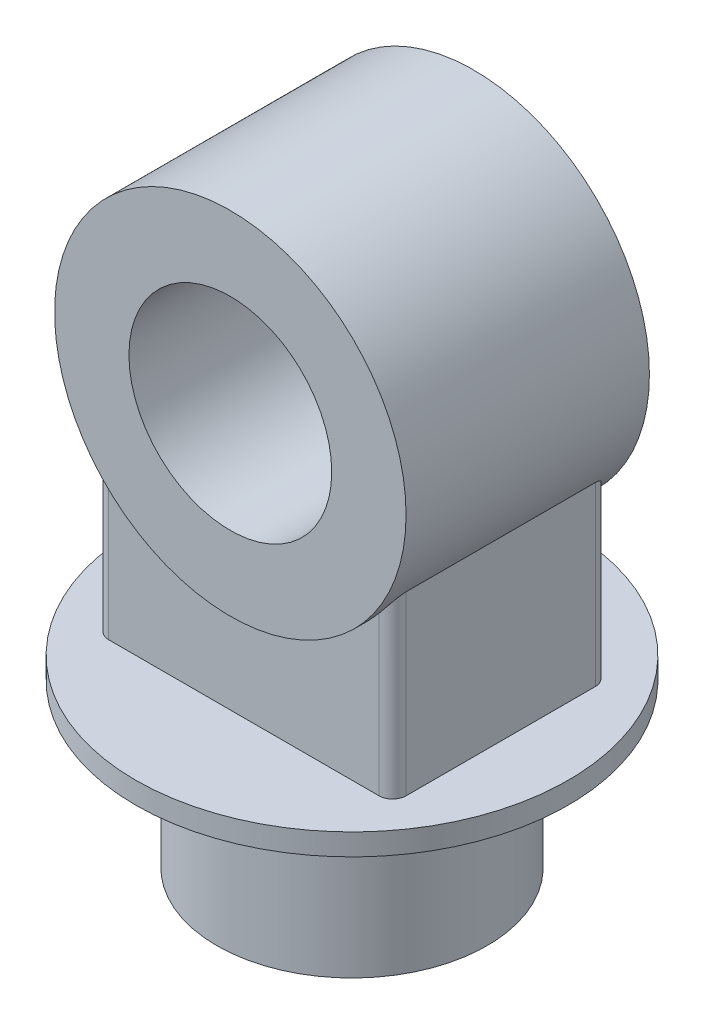
ISO-10303-21;
HEADER;
FILE_DESCRIPTION(('STEP AP214'),'2;1');
FILE_NAME('part.step','',(''),(''),'','','');
FILE_SCHEMA(('AUTOMOTIVE_DESIGN { 1 0 10303 214 1 1 1 1 }'));
ENDSEC;
DATA;
#1=APPLICATION_CONTEXT('core data for automotive mechanical design processes');
#2=APPLICATION_PROTOCOL_DEFINITION('international standard','automotive_design',2000,#1);
#3=PRODUCT_CONTEXT('',#1,'mechanical');
#4=PRODUCT('Part','Part','',(#3));
#5=PRODUCT_RELATED_PRODUCT_CATEGORY('part','',(#4));
#6=PRODUCT_DEFINITION_FORMATION('','',#4);
#7=PRODUCT_DEFINITION_CONTEXT('part definition',#1,'design');
#8=PRODUCT_DEFINITION('design','',#6,#7);
#9=PRODUCT_DEFINITION_SHAPE('','',#8);
#10=(LENGTH_UNIT() NAMED_UNIT(*) SI_UNIT(.MILLI.,.METRE.));
#11=(NAMED_UNIT(*) PLANE_ANGLE_UNIT() SI_UNIT($,.RADIAN.));
#12=(NAMED_UNIT(*) SI_UNIT($,.STERADIAN.) SOLID_ANGLE_UNIT());
#13=UNCERTAINTY_MEASURE_WITH_UNIT(LENGTH_MEASURE(1.E-05),#10,'distance_accuracy_value','');
#14=(GEOMETRIC_REPRESENTATION_CONTEXT(3) GLOBAL_UNCERTAINTY_ASSIGNED_CONTEXT((#13)) GLOBAL_UNIT_ASSIGNED_CONTEXT((#10,
#11,#12)) REPRESENTATION_CONTEXT('',''));
#15=CARTESIAN_POINT('',(0.,0.,0.));
#16=DIRECTION('',(0.,0.,1.));
#17=DIRECTION('',(1.,0.,0.));
#18=AXIS2_PLACEMENT_3D('',#15,#16,#17);
#19=CARTESIAN_POINT('',(0.,136.,0.));
#20=DIRECTION('',(0.,1.,0.));
#21=DIRECTION('',(0.,0.,1.));
#22=AXIS2_PLACEMENT_3D('',#19,#20,#21);
#23=PLANE('',#22);
#24=CARTESIAN_POINT('',(0.,136.,0.));
#25=DIRECTION('',(0.,1.,0.));
#26=DIRECTION('',(0.,0.,1.));
#27=AXIS2_PLACEMENT_3D('',#24,#25,#26);
#28=CIRCLE('',#27,160.);
#29=CARTESIAN_POINT('',(0.,136.,160.));
#30=VERTEX_POINT('',#29);
#31=EDGE_CURVE('E235',#30,#30,#28,.T.);
#32=ORIENTED_EDGE('',*,*,#31,.T.);
#33=EDGE_LOOP('',(#32));
#34=FACE_BOUND('',#33,.T.);
#35=DIRECTION('',(0.,0.,1.));
#36=VECTOR('',#35,1.);
#37=CARTESIAN_POINT('',(-110.,136.,-80.));
#38=LINE('',#37,#36);
#39=CARTESIAN_POINT('',(-110.,136.,-70.));
#40=VERTEX_POINT('',#39);
#41=CARTESIAN_POINT('',(-110.,136.,70.));
#42=VERTEX_POINT('',#41);
#43=EDGE_CURVE('E251',#40,#42,#38,.T.);
#44=ORIENTED_EDGE('',*,*,#43,.F.);
#45=CARTESIAN_POINT('',(-100.,136.000000000024,-70.));
#46=DIRECTION('',(0.,1.,0.));
#47=DIRECTION('',(0.,0.,1.));
#48=AXIS2_PLACEMENT_3D('',#45,#46,#47);
#49=CIRCLE('',#48,10.);
#50=CARTESIAN_POINT('',(-100.,136.,-80.));
#51=VERTEX_POINT('',#50);
#52=EDGE_CURVE('E61',#40,#51,#49,.F.);
#53=ORIENTED_EDGE('',*,*,#52,.T.);
#54=DIRECTION('',(-1.,0.,0.));
#55=VECTOR('',#54,1.);
#56=CARTESIAN_POINT('',(-110.,136.,-80.));
#57=LINE('',#56,#55);
#58=CARTESIAN_POINT('',(100.,136.,-80.));
#59=VERTEX_POINT('',#58);
#60=EDGE_CURVE('E139',#59,#51,#57,.T.);
#61=ORIENTED_EDGE('',*,*,#60,.F.);
#62=CARTESIAN_POINT('',(100.,136.000000000024,-70.));
#63=DIRECTION('',(0.,1.,0.));
#64=DIRECTION('',(0.,0.,1.));
#65=AXIS2_PLACEMENT_3D('',#62,#63,#64);
#66=CIRCLE('',#65,10.);
#67=CARTESIAN_POINT('',(110.,136.,-70.));
#68=VERTEX_POINT('',#67);
#69=EDGE_CURVE('E75',#59,#68,#66,.F.);
#70=ORIENTED_EDGE('',*,*,#69,.T.);
#71=DIRECTION('',(0.,0.,-1.));
#72=VECTOR('',#71,1.);
#73=CARTESIAN_POINT('',(110.,136.,-80.));
#74=LINE('',#73,#72);
#75=CARTESIAN_POINT('',(110.,136.,70.));
#76=VERTEX_POINT('',#75);
#77=EDGE_CURVE('E242',#76,#68,#74,.T.);
#78=ORIENTED_EDGE('',*,*,#77,.F.);
#79=CARTESIAN_POINT('',(100.,136.000000000024,70.));
#80=DIRECTION('',(0.,1.,0.));
#81=DIRECTION('',(0.,0.,1.));
#82=AXIS2_PLACEMENT_3D('',#79,#80,#81);
#83=CIRCLE('',#82,10.);
#84=CARTESIAN_POINT('',(100.,136.,80.));
#85=VERTEX_POINT('',#84);
#86=EDGE_CURVE('E130',#76,#85,#83,.F.);
#87=ORIENTED_EDGE('',*,*,#86,.T.);
#88=DIRECTION('',(1.,0.,0.));
#89=VECTOR('',#88,1.);
#90=CARTESIAN_POINT('',(-110.,136.,80.));
#91=LINE('',#90,#89);
#92=CARTESIAN_POINT('',(-100.,136.,80.));
#93=VERTEX_POINT('',#92);
#94=EDGE_CURVE('E248',#93,#85,#91,.T.);
#95=ORIENTED_EDGE('',*,*,#94,.F.);
#96=CARTESIAN_POINT('',(-100.,136.000000000024,70.));
#97=DIRECTION('',(0.,1.,0.));
#98=DIRECTION('',(0.,0.,1.));
#99=AXIS2_PLACEMENT_3D('',#96,#97,#98);
#100=CIRCLE('',#99,10.);
#101=EDGE_CURVE('E129',#93,#42,#100,.F.);
#102=ORIENTED_EDGE('',*,*,#101,.T.);
#103=EDGE_LOOP('',(#44,#53,#61,#70,#78,#87,#95,#102));
#104=FACE_BOUND('',#103,.T.);
#105=ADVANCED_FACE('F48',(#34,#104),#23,.T.);
#106=CARTESIAN_POINT('',(0.,120.,0.));
#107=DIRECTION('',(0.,-1.,0.));
#108=DIRECTION('',(0.,0.,-1.));
#109=AXIS2_PLACEMENT_3D('',#106,#107,#108);
#110=CYLINDRICAL_SURFACE('',#109,100.);
#111=CARTESIAN_POINT('',(0.,120.,0.));
#112=DIRECTION('',(0.,1.,0.));
#113=DIRECTION('',(0.,0.,1.));
#114=AXIS2_PLACEMENT_3D('',#111,#112,#113);
#115=CIRCLE('',#114,100.);
#116=CARTESIAN_POINT('',(0.,120.,100.));
#117=VERTEX_POINT('',#116);
#118=EDGE_CURVE('E148',#117,#117,#115,.T.);
#119=ORIENTED_EDGE('',*,*,#118,.F.);
#120=EDGE_LOOP('',(#119));
#121=FACE_BOUND('',#120,.T.);
#122=CARTESIAN_POINT('',(0.,0.,0.));
#123=DIRECTION('',(0.,1.,0.));
#124=DIRECTION('',(0.,0.,1.));
#125=AXIS2_PLACEMENT_3D('',#122,#123,#124);
#126=CIRCLE('',#125,100.);
#127=CARTESIAN_POINT('',(0.,0.,100.));
#128=VERTEX_POINT('',#127);
#129=EDGE_CURVE('E233',#128,#128,#126,.T.);
#130=ORIENTED_EDGE('',*,*,#129,.T.);
#131=EDGE_LOOP('',(#130));
#132=FACE_BOUND('',#131,.T.);
#133=ADVANCED_FACE('F177',(#121,#132),#110,.T.);
#134=CARTESIAN_POINT('',(0.,0.,0.));
#135=DIRECTION('',(0.,1.,0.));
#136=DIRECTION('',(0.,0.,1.));
#137=AXIS2_PLACEMENT_3D('',#134,#135,#136);
#138=PLANE('',#137);
#139=ORIENTED_EDGE('',*,*,#129,.F.);
#140=EDGE_LOOP('',(#139));
#141=FACE_BOUND('',#140,.T.);
#142=ADVANCED_FACE('F213',(#141),#138,.F.);
#143=CARTESIAN_POINT('',(0.,136.,0.));
#144=DIRECTION('',(0.,-1.,0.));
#145=DIRECTION('',(0.,0.,-1.));
#146=AXIS2_PLACEMENT_3D('',#143,#144,#145);
#147=CYLINDRICAL_SURFACE('',#146,160.);
#148=ORIENTED_EDGE('',*,*,#31,.F.);
#149=EDGE_LOOP('',(#148));
#150=FACE_BOUND('',#149,.T.);
#151=CARTESIAN_POINT('',(0.,120.,0.));
#152=DIRECTION('',(0.,1.,0.));
#153=DIRECTION('',(0.,0.,1.));
#154=AXIS2_PLACEMENT_3D('',#151,#152,#153);
#155=CIRCLE('',#154,160.);
#156=CARTESIAN_POINT('',(0.,120.,160.));
#157=VERTEX_POINT('',#156);
#158=EDGE_CURVE('E238',#157,#157,#155,.T.);
#159=ORIENTED_EDGE('',*,*,#158,.T.);
#160=EDGE_LOOP('',(#159));
#161=FACE_BOUND('',#160,.T.);
#162=ADVANCED_FACE('F223',(#150,#161),#147,.T.);
#163=CARTESIAN_POINT('',(0.,120.,0.));
#164=DIRECTION('',(0.,1.,0.));
#165=DIRECTION('',(0.,0.,1.));
#166=AXIS2_PLACEMENT_3D('',#163,#164,#165);
#167=PLANE('',#166);
#168=ORIENTED_EDGE('',*,*,#118,.T.);
#169=EDGE_LOOP('',(#168));
#170=FACE_BOUND('',#169,.T.);
#171=ORIENTED_EDGE('',*,*,#158,.F.);
#172=EDGE_LOOP('',(#171));
#173=FACE_BOUND('',#172,.T.);
#174=ADVANCED_FACE('F220',(#170,#173),#167,.F.);
#175=CARTESIAN_POINT('',(-110.,500000.,-80.));
#176=DIRECTION('',(0.,0.,1.));
#177=DIRECTION('',(1.,0.,0.));
#178=AXIS2_PLACEMENT_3D('',#175,#176,#177);
#179=PLANE('',#178);
#180=CARTESIAN_POINT('',(0.,336.,-80.));
#181=DIRECTION('',(0.,0.,1.));
#182=DIRECTION('',(1.,0.,0.));
#183=AXIS2_PLACEMENT_3D('',#180,#181,#182);
#184=CIRCLE('',#183,130.);
#185=CARTESIAN_POINT('',(100.,252.933761370819,-80.));
#186=VERTEX_POINT('',#185);
#187=CARTESIAN_POINT('',(-100.,252.933761370819,-80.));
#188=VERTEX_POINT('',#187);
#189=EDGE_CURVE('E140',#186,#188,#184,.F.);
#190=ORIENTED_EDGE('',*,*,#189,.F.);
#191=DIRECTION('',(0.,-1.,0.));
#192=VECTOR('',#191,1.);
#193=CARTESIAN_POINT('',(100.,500000.,-80.));
#194=LINE('',#193,#192);
#195=EDGE_CURVE('E160',#186,#59,#194,.T.);
#196=ORIENTED_EDGE('',*,*,#195,.T.);
#197=ORIENTED_EDGE('',*,*,#60,.T.);
#198=DIRECTION('',(0.,-1.,0.));
#199=VECTOR('',#198,1.);
#200=CARTESIAN_POINT('',(-100.,500000.,-80.));
#201=LINE('',#200,#199);
#202=EDGE_CURVE('E158',#51,#188,#201,.F.);
#203=ORIENTED_EDGE('',*,*,#202,.T.);
#204=EDGE_LOOP('',(#190,#196,#197,#203));
#205=FACE_BOUND('',#204,.T.);
#206=ADVANCED_FACE('F198',(#205),#179,.F.);
#207=CARTESIAN_POINT('',(110.,500000.,-80.));
#208=DIRECTION('',(-1.,0.,0.));
#209=DIRECTION('',(0.,0.,1.));
#210=AXIS2_PLACEMENT_3D('',#207,#208,#209);
#211=PLANE('',#210);
#212=DIRECTION('',(0.,0.,-1.));
#213=VECTOR('',#212,1.);
#214=CARTESIAN_POINT('',(110.,266.717967697245,90.));
#215=LINE('',#214,#213);
#216=CARTESIAN_POINT('',(110.,266.717967697245,70.));
#217=VERTEX_POINT('',#216);
#218=CARTESIAN_POINT('',(110.,266.717967697245,-70.));
#219=VERTEX_POINT('',#218);
#220=EDGE_CURVE('E122',#217,#219,#215,.T.);
#221=ORIENTED_EDGE('',*,*,#220,.F.);
#222=DIRECTION('',(0.,-1.,0.));
#223=VECTOR('',#222,1.);
#224=CARTESIAN_POINT('',(110.,500000.,70.));
#225=LINE('',#224,#223);
#226=EDGE_CURVE('E136',#217,#76,#225,.T.);
#227=ORIENTED_EDGE('',*,*,#226,.T.);
#228=ORIENTED_EDGE('',*,*,#77,.T.);
#229=DIRECTION('',(0.,-1.,0.));
#230=VECTOR('',#229,1.);
#231=CARTESIAN_POINT('',(110.,500000.,-70.));
#232=LINE('',#231,#230);
#233=EDGE_CURVE('E138',#68,#219,#232,.F.);
#234=ORIENTED_EDGE('',*,*,#233,.T.);
#235=EDGE_LOOP('',(#221,#227,#228,#234));
#236=FACE_BOUND('',#235,.T.);
#237=ADVANCED_FACE('F134',(#236),#211,.F.);
#238=CARTESIAN_POINT('',(-110.,500000.,-80.));
#239=DIRECTION('',(1.,0.,0.));
#240=DIRECTION('',(0.,0.,-1.));
#241=AXIS2_PLACEMENT_3D('',#238,#239,#240);
#242=PLANE('',#241);
#243=ORIENTED_EDGE('',*,*,#43,.T.);
#244=DIRECTION('',(0.,-1.,0.));
#245=VECTOR('',#244,1.);
#246=CARTESIAN_POINT('',(-110.,500000.,70.));
#247=LINE('',#246,#245);
#248=CARTESIAN_POINT('',(-110.,266.717967697245,70.));
#249=VERTEX_POINT('',#248);
#250=EDGE_CURVE('E156',#42,#249,#247,.F.);
#251=ORIENTED_EDGE('',*,*,#250,.T.);
#252=DIRECTION('',(0.,0.,-1.));
#253=VECTOR('',#252,1.);
#254=CARTESIAN_POINT('',(-110.,266.717967697245,90.));
#255=LINE('',#254,#253);
#256=CARTESIAN_POINT('',(-110.,266.717967697245,-70.));
#257=VERTEX_POINT('',#256);
#258=EDGE_CURVE('E200',#257,#249,#255,.F.);
#259=ORIENTED_EDGE('',*,*,#258,.F.);
#260=DIRECTION('',(0.,-1.,0.));
#261=VECTOR('',#260,1.);
#262=CARTESIAN_POINT('',(-110.,500000.,-70.));
#263=LINE('',#262,#261);
#264=EDGE_CURVE('E153',#257,#40,#263,.T.);
#265=ORIENTED_EDGE('',*,*,#264,.T.);
#266=EDGE_LOOP('',(#243,#251,#259,#265));
#267=FACE_BOUND('',#266,.T.);
#268=ADVANCED_FACE('F293',(#267),#242,.F.);
#269=CARTESIAN_POINT('',(-110.,500000.,80.));
#270=DIRECTION('',(0.,0.,-1.));
#271=DIRECTION('',(-1.,0.,0.));
#272=AXIS2_PLACEMENT_3D('',#269,#270,#271);
#273=PLANE('',#272);
#274=ORIENTED_EDGE('',*,*,#94,.T.);
#275=DIRECTION('',(0.,-1.,0.));
#276=VECTOR('',#275,1.);
#277=CARTESIAN_POINT('',(100.,500000.,80.));
#278=LINE('',#277,#276);
#279=CARTESIAN_POINT('',(100.,252.933761370819,80.));
#280=VERTEX_POINT('',#279);
#281=EDGE_CURVE('E146',#85,#280,#278,.F.);
#282=ORIENTED_EDGE('',*,*,#281,.T.);
#283=CARTESIAN_POINT('',(0.,336.,80.));
#284=DIRECTION('',(0.,0.,-1.));
#285=DIRECTION('',(-1.,0.,0.));
#286=AXIS2_PLACEMENT_3D('',#283,#284,#285);
#287=CIRCLE('',#286,130.);
#288=CARTESIAN_POINT('',(-100.,252.933761370819,80.));
#289=VERTEX_POINT('',#288);
#290=EDGE_CURVE('E125',#289,#280,#287,.F.);
#291=ORIENTED_EDGE('',*,*,#290,.F.);
#292=DIRECTION('',(0.,-1.,0.));
#293=VECTOR('',#292,1.);
#294=CARTESIAN_POINT('',(-100.,500000.,80.));
#295=LINE('',#294,#293);
#296=EDGE_CURVE('E143',#289,#93,#295,.T.);
#297=ORIENTED_EDGE('',*,*,#296,.T.);
#298=EDGE_LOOP('',(#274,#282,#291,#297));
#299=FACE_BOUND('',#298,.T.);
#300=ADVANCED_FACE('F218',(#299),#273,.F.);
#301=CARTESIAN_POINT('',(0.,336.,90.));
#302=DIRECTION('',(0.,0.,-1.));
#303=DIRECTION('',(-1.,0.,0.));
#304=AXIS2_PLACEMENT_3D('',#301,#302,#303);
#305=CYLINDRICAL_SURFACE('',#304,130.);
#306=CARTESIAN_POINT('',(0.,336.,90.));
#307=DIRECTION('',(0.,0.,1.));
#308=DIRECTION('',(1.,0.,0.));
#309=AXIS2_PLACEMENT_3D('',#306,#307,#308);
#310=CIRCLE('',#309,130.);
#311=CARTESIAN_POINT('',(130.,336.,90.));
#312=VERTEX_POINT('',#311);
#313=EDGE_CURVE('E245',#312,#312,#310,.T.);
#314=ORIENTED_EDGE('',*,*,#313,.F.);
#315=EDGE_LOOP('',(#314));
#316=FACE_BOUND('',#315,.T.);
#317=CARTESIAN_POINT('',(0.,336.,-90.));
#318=DIRECTION('',(0.,0.,1.));
#319=DIRECTION('',(1.,0.,0.));
#320=AXIS2_PLACEMENT_3D('',#317,#318,#319);
#321=CIRCLE('',#320,130.);
#322=CARTESIAN_POINT('',(130.,336.,-90.));
#323=VERTEX_POINT('',#322);
#324=EDGE_CURVE('E256',#323,#323,#321,.T.);
#325=ORIENTED_EDGE('',*,*,#324,.T.);
#326=EDGE_LOOP('',(#325));
#327=FACE_BOUND('',#326,.T.);
#328=ORIENTED_EDGE('',*,*,#290,.T.);
#329=CARTESIAN_POINT('',(100.,252.933761370819,80.));
#330=CARTESIAN_POINT('',(100.223611151915,253.202952503255,79.9999830665315));
#331=CARTESIAN_POINT('',(100.446118360057,253.473036166024,79.9924995885084));
#332=CARTESIAN_POINT('',(100.888548742496,254.014496760122,79.9629173131463));
#333=CARTESIAN_POINT('',(101.10847204376,254.285873626978,79.9408192370115));
#334=CARTESIAN_POINT('',(101.545586290072,254.829711400373,79.8822979337703));
#335=CARTESIAN_POINT('',(101.76277446753,255.102173087004,79.8458612385231));
#336=CARTESIAN_POINT('',(102.193849033468,255.647413797012,79.7588609087487));
#337=CARTESIAN_POINT('',(102.407735374993,255.920192824843,79.7082970735217));
#338=CARTESIAN_POINT('',(103.048408055095,256.74400885936,79.5343891784366));
#339=CARTESIAN_POINT('',(103.469748368072,257.294974230618,79.3894263280957));
#340=CARTESIAN_POINT('',(104.088382224678,258.117224843771,79.1288060997197));
#341=CARTESIAN_POINT('',(104.292337034927,258.39057162742,79.0347525474724));
#342=CARTESIAN_POINT('',(104.695498702643,258.935304765081,78.8319429710981));
#343=CARTESIAN_POINT('',(104.894706004332,259.206691300842,78.7231883289499));
#344=CARTESIAN_POINT('',(105.336170271764,259.812965668139,78.4620472638272));
#345=CARTESIAN_POINT('',(105.577006541077,260.147108038148,78.3055009036513));
#346=CARTESIAN_POINT('',(106.04966094987,260.809343252621,77.967808626391));
#347=CARTESIAN_POINT('',(106.281479043935,261.137436066616,77.7866625854444));
#348=CARTESIAN_POINT('',(106.734152264033,261.784259610706,77.3986376161628));
#349=CARTESIAN_POINT('',(106.955036134368,262.103013877598,77.1918317878757));
#350=CARTESIAN_POINT('',(107.384708325122,262.728803605627,76.749894392022));
#351=CARTESIAN_POINT('',(107.593501627276,263.035843875289,76.5147746155492));
#352=CARTESIAN_POINT('',(107.921279015409,263.522080966666,76.1068757916446));
#353=CARTESIAN_POINT('',(108.044709884718,263.706240813682,75.9435605188263));
#354=CARTESIAN_POINT('',(108.284949666933,264.066582834907,75.6038296157538));
#355=CARTESIAN_POINT('',(108.401760304956,264.242767084986,75.4274174262629));
#356=CARTESIAN_POINT('',(108.627683741988,264.585236991633,75.0605773993747));
#357=CARTESIAN_POINT('',(108.736797961361,264.751524473746,74.8701521613913));
#358=CARTESIAN_POINT('',(108.945874410432,265.071634412635,74.4745306992528));
#359=CARTESIAN_POINT('',(109.04583974995,265.225461102935,74.2693395369045));
#360=CARTESIAN_POINT('',(109.274660386151,265.579056080623,73.7536743100227));
#361=CARTESIAN_POINT('',(109.398046362816,265.771031349643,73.4351396850742));
#362=CARTESIAN_POINT('',(109.561336457207,266.026263049992,72.9345418523036));
#363=CARTESIAN_POINT('',(109.612072269395,266.105785634321,72.7641622498837));
#364=CARTESIAN_POINT('',(109.705421847597,266.25239837099,72.4160328323223));
#365=CARTESIAN_POINT('',(109.748040656091,266.319496241142,72.2382876769633));
#366=CARTESIAN_POINT('',(109.820262744001,266.433384610412,71.8947331689277));
#367=CARTESIAN_POINT('',(109.850752312767,266.481551609067,71.7295676109391));
#368=CARTESIAN_POINT('',(109.903691363628,266.565274678988,71.3948451418076));
#369=CARTESIAN_POINT('',(109.926143541964,266.600834979285,71.2252897238033));
#370=CARTESIAN_POINT('',(109.962659042777,266.658707696818,70.8807814271977));
#371=CARTESIAN_POINT('',(109.976613864032,266.680848750137,70.7057875562757));
#372=CARTESIAN_POINT('',(109.99061964662,266.703076138542,70.4419386674803));
#373=CARTESIAN_POINT('',(109.99413386492,266.708654625171,70.3536902139711));
#374=CARTESIAN_POINT('',(109.998824989492,266.716102079046,70.1769662160102));
#375=CARTESIAN_POINT('',(110.000001659485,266.717970671296,70.088490649507));
#376=CARTESIAN_POINT('',(110.,266.717967697245,70.));
#377=B_SPLINE_CURVE_WITH_KNOTS('',3,(#329,#330,#331,#332,#333,#334,#335,#336,#337,#338,#339,
#340,#341,#342,#343,#344,#345,#346,#347,#348,#349,#350,#351,#352,#353,#354,#355,#356,#357,#358,
#359,#360,#361,#362,#363,#364,#365,#366,#367,#368,#369,#370,#371,#372,#373,#374,#375,#376),
.UNSPECIFIED.,.F.,.F.,(4,2,2,2,2,2,2,2,2,2,2,2,2,2,2,2,2,2,2,2,2,2,2,4),(0.,1.04974156507778,
2.09943133114574,3.15010942417272,4.20080244462032,6.32356278933856,7.38465211465329,
8.44564176134495,9.7667768553939,11.0879186017609,12.4053795382948,13.7222937149076,
14.5479419827463,15.3733741023697,16.1986534888324,17.0236513022889,18.1946866504919,
18.7783719827904,19.3616935243414,19.8852298594992,20.408590403038,20.9385006934629,
21.2038887699912,21.4693036704869),.UNSPECIFIED.);
#378=EDGE_CURVE('E119',#280,#217,#377,.T.);
#379=ORIENTED_EDGE('',*,*,#378,.T.);
#380=ORIENTED_EDGE('',*,*,#220,.T.);
#381=CARTESIAN_POINT('',(110.,266.717967697245,-70.));
#382=CARTESIAN_POINT('',(110.000033683462,266.718025852698,-70.1614230595313));
#383=CARTESIAN_POINT('',(109.996092792414,266.711764254296,-70.3228118197691));
#384=CARTESIAN_POINT('',(109.980519982779,266.687045880384,-70.6441123999958));
#385=CARTESIAN_POINT('',(109.968896213713,266.668602027069,-70.8040256031146));
#386=CARTESIAN_POINT('',(109.938376398954,266.620217986395,-71.1196424551221));
#387=CARTESIAN_POINT('',(109.919558261622,266.590400967593,-71.2753727040436));
#388=CARTESIAN_POINT('',(109.875071558334,266.52000006118,-71.5834085562726));
#389=CARTESIAN_POINT('',(109.849400846184,266.479412800404,-71.7357130704249));
#390=CARTESIAN_POINT('',(109.784772267017,266.377386983169,-72.0722520040974));
#391=CARTESIAN_POINT('',(109.744103525393,266.313281105856,-72.2553511890568));
#392=CARTESIAN_POINT('',(109.654040532803,266.17165023193,-72.6141464391851));
#393=CARTESIAN_POINT('',(109.604640075501,266.094115691273,-72.7898371277865));
#394=CARTESIAN_POINT('',(109.497968805892,265.927147418338,-73.133872391345));
#395=CARTESIAN_POINT('',(109.440667457039,265.837667562915,-73.302184951541));
#396=CARTESIAN_POINT('',(109.319341126161,265.648779195145,-73.6304969218558));
#397=CARTESIAN_POINT('',(109.25531768694,265.549372961282,-73.7904982269664));
#398=CARTESIAN_POINT('',(109.085069343255,265.28590129292,-74.1868876463209));
#399=CARTESIAN_POINT('',(108.974781990569,265.115997241409,-74.4176642111939));
#400=CARTESIAN_POINT('',(108.742772943656,264.76058359918,-74.8607110351427));
#401=CARTESIAN_POINT('',(108.621044869784,264.575065307649,-75.072970840064));
#402=CARTESIAN_POINT('',(108.36794946479,264.19164129378,-75.4804206329535));
#403=CARTESIAN_POINT('',(108.236568322626,263.993717884812,-75.6755852518652));
#404=CARTESIAN_POINT('',(107.965814499919,263.588382733388,-76.0497203250662));
#405=CARTESIAN_POINT('',(107.826442440892,263.380971729107,-76.2286920360201));
#406=CARTESIAN_POINT('',(107.56145650763,262.989174407744,-76.5468161797372));
#407=CARTESIAN_POINT('',(107.436764821801,262.805791987749,-76.6879854690674));
#408=CARTESIAN_POINT('',(107.182869679799,262.434497987953,-76.9599552926783));
#409=CARTESIAN_POINT('',(107.053665586411,262.24658576965,-77.0907543539386));
#410=CARTESIAN_POINT('',(106.659844344167,261.677121003612,-77.4685356621902));
#411=CARTESIAN_POINT('',(106.389102445143,261.289965080353,-77.7008024816961));
#412=CARTESIAN_POINT('',(105.833418194947,260.504836154638,-78.129863631631));
#413=CARTESIAN_POINT('',(105.548442441802,260.106838810795,-78.3265689888296));
#414=CARTESIAN_POINT('',(104.96676628824,259.304344779382,-78.6860846955172));
#415=CARTESIAN_POINT('',(104.670068038633,258.899849292081,-78.8489012287858));
#416=CARTESIAN_POINT('',(104.024574509401,258.030646711215,-79.1623550419402));
#417=CARTESIAN_POINT('',(103.674248758637,257.565348460988,-79.3081944572228));
#418=CARTESIAN_POINT('',(102.961876677953,256.632523338709,-79.558756520093));
#419=CARTESIAN_POINT('',(102.599828734006,256.16499616738,-79.6634734792563));
#420=CARTESIAN_POINT('',(102.051092736822,255.466397204689,-79.7891645729388));
#421=CARTESIAN_POINT('',(101.868137468165,255.235094848973,-79.8257282191265));
#422=CARTESIAN_POINT('',(101.499966150616,254.77288550036,-79.8886289353229));
#423=CARTESIAN_POINT('',(101.314750133026,254.541978502041,-79.9149661467555));
#424=CARTESIAN_POINT('',(100.942320486513,254.080919722901,-79.9572665465168));
#425=CARTESIAN_POINT('',(100.755107350153,253.850767773367,-79.9732322353467));
#426=CARTESIAN_POINT('',(100.378860262163,253.391449185777,-79.9945948234744));
#427=CARTESIAN_POINT('',(100.189826234412,253.162282589497,-79.9999912789888));
#428=CARTESIAN_POINT('',(100.,252.933761370819,-80.));
#429=B_SPLINE_CURVE_WITH_KNOTS('',3,(#381,#382,#383,#384,#385,#386,#387,#388,#389,#390,#391,
#392,#393,#394,#395,#396,#397,#398,#399,#400,#401,#402,#403,#404,#405,#406,#407,#408,#409,#410,
#411,#412,#413,#414,#415,#416,#417,#418,#419,#420,#421,#422,#423,#424,#425,#426,#427,#428),
.UNSPECIFIED.,.F.,.F.,(4,2,2,2,2,2,2,2,2,2,2,2,2,2,2,2,2,2,2,2,2,2,2,4),(0.,0.484045005923083,
0.96757738914542,1.44601544684507,1.92460352520313,2.51835043890465,3.11252108624072,
3.70905613988736,4.30545457926274,5.22516595363376,6.14539326092329,7.06696382284191,
7.98846280401962,8.7768009200054,9.56525081419901,11.1426900482287,12.7240229357798,
14.305067020047,16.1047501551828,17.9046821508918,18.7960435003638,19.6873925225409,
20.5785265668947,21.4696980275819),.UNSPECIFIED.);
#430=EDGE_CURVE('E190',#219,#186,#429,.T.);
#431=ORIENTED_EDGE('',*,*,#430,.T.);
#432=ORIENTED_EDGE('',*,*,#189,.T.);
#433=CARTESIAN_POINT('',(-100.,252.933761370819,-80.));
#434=CARTESIAN_POINT('',(-100.223611151915,253.202952503255,-79.9999830665315));
#435=CARTESIAN_POINT('',(-100.446118360057,253.473036166024,-79.9924995885085));
#436=CARTESIAN_POINT('',(-100.888548742496,254.014496760122,-79.9629173131463));
#437=CARTESIAN_POINT('',(-101.108472043759,254.285873626978,-79.9408192370116));
#438=CARTESIAN_POINT('',(-101.545586290072,254.829711400373,-79.8822979337703));
#439=CARTESIAN_POINT('',(-101.76277446753,255.102173087004,-79.8458612385231));
#440=CARTESIAN_POINT('',(-102.193849033468,255.647413797012,-79.7588609087488));
#441=CARTESIAN_POINT('',(-102.407735374993,255.920192824843,-79.7082970735217));
#442=CARTESIAN_POINT('',(-103.048408055095,256.74400885936,-79.5343891784366));
#443=CARTESIAN_POINT('',(-103.469748368072,257.294974230618,-79.3894263280958));
#444=CARTESIAN_POINT('',(-104.088382224678,258.117224843771,-79.1288060997198));
#445=CARTESIAN_POINT('',(-104.292337034927,258.39057162742,-79.0347525474725));
#446=CARTESIAN_POINT('',(-104.695498702643,258.935304765081,-78.8319429710982));
#447=CARTESIAN_POINT('',(-104.894706004332,259.206691300842,-78.7231883289499));
#448=CARTESIAN_POINT('',(-105.336170271764,259.812965668139,-78.4620472638272));
#449=CARTESIAN_POINT('',(-105.577006541077,260.147108038148,-78.3055009036513));
#450=CARTESIAN_POINT('',(-106.049660949871,260.809343252621,-77.967808626391));
#451=CARTESIAN_POINT('',(-106.281479043935,261.137436066616,-77.7866625854443));
#452=CARTESIAN_POINT('',(-106.734152264033,261.784259610706,-77.3986376161628));
#453=CARTESIAN_POINT('',(-106.955036134368,262.103013877599,-77.1918317878757));
#454=CARTESIAN_POINT('',(-107.384708325122,262.728803605627,-76.749894392022));
#455=CARTESIAN_POINT('',(-107.593501627276,263.035843875289,-76.5147746155492));
#456=CARTESIAN_POINT('',(-107.921279015409,263.522080966667,-76.1068757916446));
#457=CARTESIAN_POINT('',(-108.044709884718,263.706240813682,-75.9435605188263));
#458=CARTESIAN_POINT('',(-108.284949666933,264.066582834907,-75.6038296157538));
#459=CARTESIAN_POINT('',(-108.401760304956,264.242767084986,-75.4274174262629));
#460=CARTESIAN_POINT('',(-108.627683741988,264.585236991633,-75.0605773993747));
#461=CARTESIAN_POINT('',(-108.736797961361,264.751524473746,-74.8701521613913));
#462=CARTESIAN_POINT('',(-108.945874410432,265.071634412635,-74.4745306992528));
#463=CARTESIAN_POINT('',(-109.04583974995,265.225461102935,-74.2693395369046));
#464=CARTESIAN_POINT('',(-109.274660386151,265.579056080623,-73.7536743100228));
#465=CARTESIAN_POINT('',(-109.398046362816,265.771031349643,-73.4351396850743));
#466=CARTESIAN_POINT('',(-109.561336457207,266.026263049992,-72.9345418523036));
#467=CARTESIAN_POINT('',(-109.612072269395,266.105785634321,-72.7641622498837));
#468=CARTESIAN_POINT('',(-109.705421847597,266.25239837099,-72.4160328323223));
#469=CARTESIAN_POINT('',(-109.748040656091,266.319496241142,-72.2382876769633));
#470=CARTESIAN_POINT('',(-109.820262744001,266.433384610412,-71.8947331689277));
#471=CARTESIAN_POINT('',(-109.850752312767,266.481551609067,-71.7295676109391));
#472=CARTESIAN_POINT('',(-109.903691363628,266.565274678988,-71.3948451418077));
#473=CARTESIAN_POINT('',(-109.926143541964,266.600834979285,-71.2252897238033));
#474=CARTESIAN_POINT('',(-109.962659042777,266.658707696818,-70.8807814271978));
#475=CARTESIAN_POINT('',(-109.976613864032,266.680848750137,-70.7057875562757));
#476=CARTESIAN_POINT('',(-109.99061964662,266.703076138542,-70.4419386674803));
#477=CARTESIAN_POINT('',(-109.99413386492,266.708654625171,-70.3536902139711));
#478=CARTESIAN_POINT('',(-109.998824989492,266.716102079046,-70.1769662160102));
#479=CARTESIAN_POINT('',(-110.000001659485,266.717970671296,-70.088490649507));
#480=CARTESIAN_POINT('',(-110.,266.717967697245,-70.));
#481=B_SPLINE_CURVE_WITH_KNOTS('',3,(#433,#434,#435,#436,#437,#438,#439,#440,#441,#442,#443,
#444,#445,#446,#447,#448,#449,#450,#451,#452,#453,#454,#455,#456,#457,#458,#459,#460,#461,#462,
#463,#464,#465,#466,#467,#468,#469,#470,#471,#472,#473,#474,#475,#476,#477,#478,#479,#480),
.UNSPECIFIED.,.F.,.F.,(4,2,2,2,2,2,2,2,2,2,2,2,2,2,2,2,2,2,2,2,2,2,2,4),(0.,1.04974156507778,
2.09943133114569,3.15010942417261,4.20080244462032,6.32356278933855,7.3846521146533,
8.44564176134496,9.76677685539395,11.087918601761,12.4053795382949,13.7222937149077,
14.5479419827463,15.3733741023697,16.1986534888325,17.0236513022888,18.1946866504919,
18.7783719827904,19.3616935243415,19.8852298594992,20.408590403038,20.9385006934629,
21.2038887699912,21.4693036704869),.UNSPECIFIED.);
#482=EDGE_CURVE('E13',#188,#257,#481,.T.);
#483=ORIENTED_EDGE('',*,*,#482,.T.);
#484=ORIENTED_EDGE('',*,*,#258,.T.);
#485=CARTESIAN_POINT('',(-110.,266.717967697245,70.));
#486=CARTESIAN_POINT('',(-110.000033683462,266.718025852698,70.1614230595313));
#487=CARTESIAN_POINT('',(-109.996092792414,266.711764254296,70.3228118197691));
#488=CARTESIAN_POINT('',(-109.980519982779,266.687045880384,70.6441123999957));
#489=CARTESIAN_POINT('',(-109.968896213713,266.668602027069,70.8040256031146));
#490=CARTESIAN_POINT('',(-109.938376398954,266.620217986395,71.119642455122));
#491=CARTESIAN_POINT('',(-109.919558261622,266.590400967593,71.2753727040436));
#492=CARTESIAN_POINT('',(-109.875071558334,266.52000006118,71.5834085562726));
#493=CARTESIAN_POINT('',(-109.849400846184,266.479412800404,71.7357130704249));
#494=CARTESIAN_POINT('',(-109.784772267017,266.377386983169,72.0722520040974));
#495=CARTESIAN_POINT('',(-109.744103525393,266.313281105856,72.2553511890568));
#496=CARTESIAN_POINT('',(-109.654040532803,266.17165023193,72.6141464391851));
#497=CARTESIAN_POINT('',(-109.604640075501,266.094115691273,72.7898371277864));
#498=CARTESIAN_POINT('',(-109.497968805892,265.927147418338,73.133872391345));
#499=CARTESIAN_POINT('',(-109.440667457039,265.837667562915,73.302184951541));
#500=CARTESIAN_POINT('',(-109.319341126161,265.648779195145,73.6304969218558));
#501=CARTESIAN_POINT('',(-109.25531768694,265.549372961282,73.7904982269664));
#502=CARTESIAN_POINT('',(-109.085069343255,265.28590129292,74.1868876463209));
#503=CARTESIAN_POINT('',(-108.974781990569,265.115997241409,74.4176642111938));
#504=CARTESIAN_POINT('',(-108.742772943656,264.76058359918,74.8607110351426));
#505=CARTESIAN_POINT('',(-108.621044869784,264.575065307649,75.072970840064));
#506=CARTESIAN_POINT('',(-108.36794946479,264.19164129378,75.4804206329534));
#507=CARTESIAN_POINT('',(-108.236568322626,263.993717884812,75.6755852518652));
#508=CARTESIAN_POINT('',(-107.965814499919,263.588382733387,76.0497203250661));
#509=CARTESIAN_POINT('',(-107.826442440892,263.380971729107,76.2286920360201));
#510=CARTESIAN_POINT('',(-107.56145650763,262.989174407744,76.5468161797372));
#511=CARTESIAN_POINT('',(-107.436764821801,262.805791987749,76.6879854690673));
#512=CARTESIAN_POINT('',(-107.182869679799,262.434497987953,76.9599552926783));
#513=CARTESIAN_POINT('',(-107.053665586411,262.24658576965,77.0907543539385));
#514=CARTESIAN_POINT('',(-106.659844344167,261.677121003612,77.4685356621902));
#515=CARTESIAN_POINT('',(-106.389102445143,261.289965080353,77.700802481696));
#516=CARTESIAN_POINT('',(-105.833418194947,260.504836154638,78.129863631631));
#517=CARTESIAN_POINT('',(-105.548442441802,260.106838810795,78.3265689888296));
#518=CARTESIAN_POINT('',(-104.96676628824,259.304344779382,78.6860846955171));
#519=CARTESIAN_POINT('',(-104.670068038633,258.899849292081,78.8489012287858));
#520=CARTESIAN_POINT('',(-104.024574509401,258.030646711215,79.1623550419402));
#521=CARTESIAN_POINT('',(-103.674248758637,257.565348460988,79.3081944572228));
#522=CARTESIAN_POINT('',(-102.961876677953,256.632523338709,79.5587565200929));
#523=CARTESIAN_POINT('',(-102.599828734006,256.16499616738,79.6634734792563));
#524=CARTESIAN_POINT('',(-102.051092736822,255.466397204689,79.7891645729387));
#525=CARTESIAN_POINT('',(-101.868137468165,255.235094848973,79.8257282191264));
#526=CARTESIAN_POINT('',(-101.499966150616,254.77288550036,79.8886289353229));
#527=CARTESIAN_POINT('',(-101.314750133026,254.541978502041,79.9149661467555));
#528=CARTESIAN_POINT('',(-100.942320486513,254.080919722901,79.9572665465167));
#529=CARTESIAN_POINT('',(-100.755107350153,253.850767773367,79.9732322353467));
#530=CARTESIAN_POINT('',(-100.378860262163,253.391449185777,79.9945948234744));
#531=CARTESIAN_POINT('',(-100.189826234412,253.162282589497,79.9999912789887));
#532=CARTESIAN_POINT('',(-100.,252.933761370819,80.));
#533=B_SPLINE_CURVE_WITH_KNOTS('',3,(#485,#486,#487,#488,#489,#490,#491,#492,#493,#494,#495,
#496,#497,#498,#499,#500,#501,#502,#503,#504,#505,#506,#507,#508,#509,#510,#511,#512,#513,#514,
#515,#516,#517,#518,#519,#520,#521,#522,#523,#524,#525,#526,#527,#528,#529,#530,#531,#532),
.UNSPECIFIED.,.F.,.F.,(4,2,2,2,2,2,2,2,2,2,2,2,2,2,2,2,2,2,2,2,2,2,2,4),(0.,0.484045005923084,
0.967577389145413,1.44601544684507,1.92460352520314,2.51835043890464,3.11252108624072,
3.70905613988738,4.30545457926271,5.2251659536337,6.14539326092324,7.06696382284187,
7.9884628040196,8.77680092000535,9.56525081419892,11.1426900482286,12.7240229357797,
14.3050670200469,16.1047501551828,17.9046821508917,18.7960435003637,19.6873925225409,
20.5785265668947,21.4696980275818),.UNSPECIFIED.);
#534=EDGE_CURVE('E184',#249,#289,#533,.T.);
#535=ORIENTED_EDGE('',*,*,#534,.T.);
#536=EDGE_LOOP('',(#328,#379,#380,#431,#432,#483,#484,#535));
#537=FACE_BOUND('',#536,.T.);
#538=ADVANCED_FACE('F121',(#316,#327,#537),#305,.T.);
#539=CARTESIAN_POINT('',(0.,336.,90.));
#540=DIRECTION('',(0.,0.,-1.));
#541=DIRECTION('',(-1.,0.,0.));
#542=AXIS2_PLACEMENT_3D('',#539,#540,#541);
#543=CYLINDRICAL_SURFACE('',#542,75.);
#544=CARTESIAN_POINT('',(0.,336.,90.));
#545=DIRECTION('',(0.,0.,1.));
#546=DIRECTION('',(1.,0.,0.));
#547=AXIS2_PLACEMENT_3D('',#544,#545,#546);
#548=CIRCLE('',#547,75.);
#549=CARTESIAN_POINT('',(-75.,336.,90.));
#550=VERTEX_POINT('',#549);
#551=EDGE_CURVE('E259',#550,#550,#548,.T.);
#552=CARTESIAN_POINT('',(0.,336.,-90.));
#553=DIRECTION('',(0.,0.,1.));
#554=DIRECTION('',(1.,0.,0.));
#555=AXIS2_PLACEMENT_3D('',#552,#553,#554);
#556=CIRCLE('',#555,75.);
#557=CARTESIAN_POINT('',(-75.,336.,-90.));
#558=VERTEX_POINT('',#557);
#559=EDGE_CURVE('E260',#558,#558,#556,.T.);
#560=CARTESIAN_POINT('',(-75.,336.,90.));
#561=CARTESIAN_POINT('',(-75.,336.,88.125));
#562=CARTESIAN_POINT('',(-75.,336.,86.25));
#563=CARTESIAN_POINT('',(-75.,336.,82.5));
#564=CARTESIAN_POINT('',(-75.,336.,80.625));
#565=CARTESIAN_POINT('',(-75.,336.,76.875));
#566=CARTESIAN_POINT('',(-75.,336.,75.));
#567=CARTESIAN_POINT('',(-75.,336.,71.25));
#568=CARTESIAN_POINT('',(-75.,336.,69.375));
#569=CARTESIAN_POINT('',(-75.,336.,65.625));
#570=CARTESIAN_POINT('',(-75.,336.,63.75));
#571=CARTESIAN_POINT('',(-75.,336.,60.));
#572=CARTESIAN_POINT('',(-75.,336.,58.125));
#573=CARTESIAN_POINT('',(-75.,336.,54.375));
#574=CARTESIAN_POINT('',(-75.,336.,52.5));
#575=CARTESIAN_POINT('',(-75.,336.,48.75));
#576=CARTESIAN_POINT('',(-75.,336.,46.875));
#577=CARTESIAN_POINT('',(-75.,336.,43.125));
#578=CARTESIAN_POINT('',(-75.,336.,41.25));
#579=CARTESIAN_POINT('',(-75.,336.,37.5));
#580=CARTESIAN_POINT('',(-75.,336.,35.625));
#581=CARTESIAN_POINT('',(-75.,336.,31.875));
#582=CARTESIAN_POINT('',(-75.,336.,30.));
#583=CARTESIAN_POINT('',(-75.,336.,26.25));
#584=CARTESIAN_POINT('',(-75.,336.,24.375));
#585=CARTESIAN_POINT('',(-75.,336.,20.625));
#586=CARTESIAN_POINT('',(-75.,336.,18.75));
#587=CARTESIAN_POINT('',(-75.,336.,15.));
#588=CARTESIAN_POINT('',(-75.,336.,13.125));
#589=CARTESIAN_POINT('',(-75.,336.,9.37499999999998));
#590=CARTESIAN_POINT('',(-75.,336.,7.49999999999998));
#591=CARTESIAN_POINT('',(-75.,336.,3.74999999999998));
#592=CARTESIAN_POINT('',(-75.,336.,1.87499999999997));
#593=CARTESIAN_POINT('',(-75.,336.,-1.87500000000003));
#594=CARTESIAN_POINT('',(-75.,336.,-3.75000000000003));
#595=CARTESIAN_POINT('',(-75.,336.,-7.50000000000003));
#596=CARTESIAN_POINT('',(-75.,336.,-9.37500000000004));
#597=CARTESIAN_POINT('',(-75.,336.,-13.125));
#598=CARTESIAN_POINT('',(-75.,336.,-15.));
#599=CARTESIAN_POINT('',(-75.,336.,-18.75));
#600=CARTESIAN_POINT('',(-75.,336.,-20.625));
#601=CARTESIAN_POINT('',(-75.,336.,-24.375));
#602=CARTESIAN_POINT('',(-75.,336.,-26.25));
#603=CARTESIAN_POINT('',(-75.,336.,-30.));
#604=CARTESIAN_POINT('',(-75.,336.,-31.875));
#605=CARTESIAN_POINT('',(-75.,336.,-35.625));
#606=CARTESIAN_POINT('',(-75.,336.,-37.5));
#607=CARTESIAN_POINT('',(-75.,336.,-41.25));
#608=CARTESIAN_POINT('',(-75.,336.,-43.125));
#609=CARTESIAN_POINT('',(-75.,336.,-46.875));
#610=CARTESIAN_POINT('',(-75.,336.,-48.75));
#611=CARTESIAN_POINT('',(-75.,336.,-52.5));
#612=CARTESIAN_POINT('',(-75.,336.,-54.375));
#613=CARTESIAN_POINT('',(-75.,336.,-58.125));
#614=CARTESIAN_POINT('',(-75.,336.,-60.));
#615=CARTESIAN_POINT('',(-75.,336.,-63.75));
#616=CARTESIAN_POINT('',(-75.,336.,-65.625));
#617=CARTESIAN_POINT('',(-75.,336.,-69.375));
#618=CARTESIAN_POINT('',(-75.,336.,-71.25));
#619=CARTESIAN_POINT('',(-75.,336.,-75.));
#620=CARTESIAN_POINT('',(-75.,336.,-76.875));
#621=CARTESIAN_POINT('',(-75.,336.,-80.625));
#622=CARTESIAN_POINT('',(-75.,336.,-82.5));
#623=CARTESIAN_POINT('',(-75.,336.,-86.25));
#624=CARTESIAN_POINT('',(-75.,336.,-88.125));
#625=CARTESIAN_POINT('',(-75.,336.,-90.));
#626=B_SPLINE_CURVE_WITH_KNOTS('',3,(#560,#561,#562,#563,#564,#565,#566,#567,#568,#569,#570,
#571,#572,#573,#574,#575,#576,#577,#578,#579,#580,#581,#582,#583,#584,#585,#586,#587,#588,#589,
#590,#591,#592,#593,#594,#595,#596,#597,#598,#599,#600,#601,#602,#603,#604,#605,#606,#607,#608,
#609,#610,#611,#612,#613,#614,#615,#616,#617,#618,#619,#620,#621,#622,#623,#624,#625),
.UNSPECIFIED.,.F.,.F.,(4,2,2,2,2,2,2,2,2,2,2,2,2,2,2,2,2,2,2,2,2,2,2,2,2,2,2,2,2,2,2,2,4),(0.,
5.62499999999999,11.25,16.875,22.5,28.125,33.75,39.375,45.,50.625,56.25,61.875,67.5,73.125,
78.75,84.375,90.,95.625,101.25,106.875,112.5,118.125,123.75,129.375,135.,140.625,146.25,151.875,
157.5,163.125,168.75,174.375,180.),.UNSPECIFIED.);
#627=EDGE_CURVE('BSEAM268',#550,#558,#626,.T.);
#628=ORIENTED_EDGE('',*,*,#551,.T.);
#629=ORIENTED_EDGE('',*,*,#559,.F.);
#630=ORIENTED_EDGE('',*,*,#627,.T.);
#631=ORIENTED_EDGE('',*,*,#627,.F.);
#632=EDGE_LOOP('',(#628,#630,#629,#631));
#633=FACE_BOUND('',#632,.T.);
#634=ADVANCED_FACE('F268',(#633),#543,.F.);
#635=CARTESIAN_POINT('',(0.,0.,90.));
#636=DIRECTION('',(0.,0.,1.));
#637=DIRECTION('',(1.,0.,0.));
#638=AXIS2_PLACEMENT_3D('',#635,#636,#637);
#639=PLANE('',#638);
#640=ORIENTED_EDGE('',*,*,#551,.F.);
#641=EDGE_LOOP('',(#640));
#642=FACE_BOUND('',#641,.T.);
#643=ORIENTED_EDGE('',*,*,#313,.T.);
#644=EDGE_LOOP('',(#643));
#645=FACE_BOUND('',#644,.T.);
#646=ADVANCED_FACE('F271',(#642,#645),#639,.T.);
#647=CARTESIAN_POINT('',(0.,0.,-90.));
#648=DIRECTION('',(0.,0.,1.));
#649=DIRECTION('',(1.,0.,0.));
#650=AXIS2_PLACEMENT_3D('',#647,#648,#649);
#651=PLANE('',#650);
#652=ORIENTED_EDGE('',*,*,#559,.T.);
#653=EDGE_LOOP('',(#652));
#654=FACE_BOUND('',#653,.T.);
#655=ORIENTED_EDGE('',*,*,#324,.F.);
#656=EDGE_LOOP('',(#655));
#657=FACE_BOUND('',#656,.T.);
#658=ADVANCED_FACE('F176',(#654,#657),#651,.F.);
#659=CARTESIAN_POINT('',(100.,500000.,70.));
#660=DIRECTION('',(0.,-1.,0.));
#661=DIRECTION('',(0.,0.,-1.));
#662=AXIS2_PLACEMENT_3D('',#659,#660,#661);
#663=CYLINDRICAL_SURFACE('',#662,10.);
#664=ORIENTED_EDGE('',*,*,#378,.F.);
#665=ORIENTED_EDGE('',*,*,#281,.F.);
#666=ORIENTED_EDGE('',*,*,#86,.F.);
#667=ORIENTED_EDGE('',*,*,#226,.F.);
#668=EDGE_LOOP('',(#664,#665,#666,#667));
#669=FACE_BOUND('',#668,.T.);
#670=ADVANCED_FACE('F142',(#669),#663,.T.);
#671=CARTESIAN_POINT('',(-100.,500000.,70.));
#672=DIRECTION('',(0.,-1.,0.));
#673=DIRECTION('',(0.,0.,-1.));
#674=AXIS2_PLACEMENT_3D('',#671,#672,#673);
#675=CYLINDRICAL_SURFACE('',#674,10.);
#676=ORIENTED_EDGE('',*,*,#534,.F.);
#677=ORIENTED_EDGE('',*,*,#250,.F.);
#678=ORIENTED_EDGE('',*,*,#101,.F.);
#679=ORIENTED_EDGE('',*,*,#296,.F.);
#680=EDGE_LOOP('',(#676,#677,#678,#679));
#681=FACE_BOUND('',#680,.T.);
#682=ADVANCED_FACE('F175',(#681),#675,.T.);
#683=CARTESIAN_POINT('',(100.,500000.,-70.));
#684=DIRECTION('',(0.,-1.,0.));
#685=DIRECTION('',(0.,0.,-1.));
#686=AXIS2_PLACEMENT_3D('',#683,#684,#685);
#687=CYLINDRICAL_SURFACE('',#686,10.);
#688=ORIENTED_EDGE('',*,*,#430,.F.);
#689=ORIENTED_EDGE('',*,*,#233,.F.);
#690=ORIENTED_EDGE('',*,*,#69,.F.);
#691=ORIENTED_EDGE('',*,*,#195,.F.);
#692=EDGE_LOOP('',(#688,#689,#690,#691));
#693=FACE_BOUND('',#692,.T.);
#694=ADVANCED_FACE('F181',(#693),#687,.T.);
#695=CARTESIAN_POINT('',(-100.,500000.,-70.));
#696=DIRECTION('',(0.,-1.,0.));
#697=DIRECTION('',(0.,0.,-1.));
#698=AXIS2_PLACEMENT_3D('',#695,#696,#697);
#699=CYLINDRICAL_SURFACE('',#698,10.);
#700=ORIENTED_EDGE('',*,*,#482,.F.);
#701=ORIENTED_EDGE('',*,*,#202,.F.);
#702=ORIENTED_EDGE('',*,*,#52,.F.);
#703=ORIENTED_EDGE('',*,*,#264,.F.);
#704=EDGE_LOOP('',(#700,#701,#702,#703));
#705=FACE_BOUND('',#704,.T.);
#706=ADVANCED_FACE('F50',(#705),#699,.T.);
#707=CLOSED_SHELL('',(#105,#133,#142,#162,#174,#206,#237,#268,#300,#538,#634,#646,#658,#670,
#682,#694,#706));
#708=MANIFOLD_SOLID_BREP('B2',#707);
#709=ADVANCED_BREP_SHAPE_REPRESENTATION('',(#18,#708),#14);
#710=SHAPE_DEFINITION_REPRESENTATION(#9,#709);
ENDSEC;
END-ISO-10303-21;
